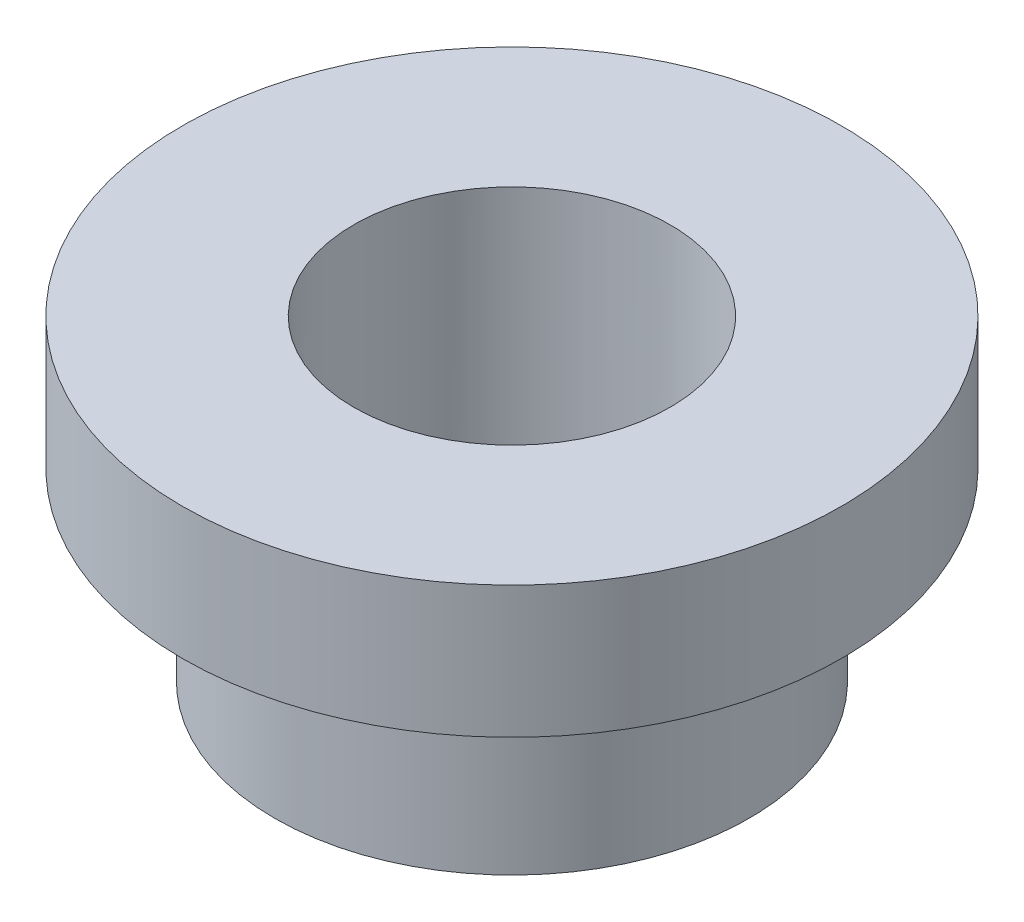
ISO-10303-21;
HEADER;
FILE_DESCRIPTION(('STEP AP214'),'2;1');
FILE_NAME('part.step','',(''),(''),'','','');
FILE_SCHEMA(('AUTOMOTIVE_DESIGN { 1 0 10303 214 1 1 1 1 }'));
ENDSEC;
DATA;
#1=APPLICATION_CONTEXT('core data for automotive mechanical design processes');
#2=APPLICATION_PROTOCOL_DEFINITION('international standard','automotive_design',2000,#1);
#3=PRODUCT_CONTEXT('',#1,'mechanical');
#4=PRODUCT('Part','Part','',(#3));
#5=PRODUCT_RELATED_PRODUCT_CATEGORY('part','',(#4));
#6=PRODUCT_DEFINITION_FORMATION('','',#4);
#7=PRODUCT_DEFINITION_CONTEXT('part definition',#1,'design');
#8=PRODUCT_DEFINITION('design','',#6,#7);
#9=PRODUCT_DEFINITION_SHAPE('','',#8);
#10=(LENGTH_UNIT() NAMED_UNIT(*) SI_UNIT(.MILLI.,.METRE.));
#11=(NAMED_UNIT(*) PLANE_ANGLE_UNIT() SI_UNIT($,.RADIAN.));
#12=(NAMED_UNIT(*) SI_UNIT($,.STERADIAN.) SOLID_ANGLE_UNIT());
#13=UNCERTAINTY_MEASURE_WITH_UNIT(LENGTH_MEASURE(1.E-05),#10,'distance_accuracy_value','');
#14=(GEOMETRIC_REPRESENTATION_CONTEXT(3) GLOBAL_UNCERTAINTY_ASSIGNED_CONTEXT((#13)) GLOBAL_UNIT_ASSIGNED_CONTEXT((#10,
#11,#12)) REPRESENTATION_CONTEXT('',''));
#15=CARTESIAN_POINT('',(0.,0.,0.));
#16=DIRECTION('',(0.,0.,1.));
#17=DIRECTION('',(1.,0.,0.));
#18=AXIS2_PLACEMENT_3D('',#15,#16,#17);
#19=CARTESIAN_POINT('',(0.,-0.5,0.));
#20=DIRECTION('',(0.,1.,0.));
#21=DIRECTION('',(0.,0.,1.));
#22=AXIS2_PLACEMENT_3D('',#19,#20,#21);
#23=PLANE('',#22);
#24=CARTESIAN_POINT('',(0.,-0.5,0.));
#25=DIRECTION('',(0.,1.,0.));
#26=DIRECTION('',(0.,0.,1.));
#27=AXIS2_PLACEMENT_3D('',#24,#25,#26);
#28=CIRCLE('',#27,1.25);
#29=CARTESIAN_POINT('',(0.,-0.5,1.25));
#30=VERTEX_POINT('',#29);
#31=EDGE_CURVE('E42',#30,#30,#28,.T.);
#32=ORIENTED_EDGE('',*,*,#31,.F.);
#33=EDGE_LOOP('',(#32));
#34=FACE_BOUND('',#33,.T.);
#35=CARTESIAN_POINT('',(0.,-0.5,0.));
#36=DIRECTION('',(0.,1.,0.));
#37=DIRECTION('',(0.,0.,1.));
#38=AXIS2_PLACEMENT_3D('',#35,#36,#37);
#39=CIRCLE('',#38,0.9);
#40=CARTESIAN_POINT('',(0.,-0.5,0.9));
#41=VERTEX_POINT('',#40);
#42=EDGE_CURVE('E10',#41,#41,#39,.F.);
#43=ORIENTED_EDGE('',*,*,#42,.F.);
#44=EDGE_LOOP('',(#43));
#45=FACE_BOUND('',#44,.T.);
#46=ADVANCED_FACE('F35',(#34,#45),#23,.F.);
#47=CARTESIAN_POINT('',(0.,-0.5,0.));
#48=DIRECTION('',(0.,1.,0.));
#49=DIRECTION('',(0.,0.,1.));
#50=AXIS2_PLACEMENT_3D('',#47,#48,#49);
#51=CYLINDRICAL_SURFACE('',#50,1.25);
#52=ORIENTED_EDGE('',*,*,#31,.T.);
#53=EDGE_LOOP('',(#52));
#54=FACE_BOUND('',#53,.T.);
#55=CARTESIAN_POINT('',(0.,0.,0.));
#56=DIRECTION('',(0.,1.,0.));
#57=DIRECTION('',(0.,0.,1.));
#58=AXIS2_PLACEMENT_3D('',#55,#56,#57);
#59=CIRCLE('',#58,1.25);
#60=CARTESIAN_POINT('',(0.,0.,1.25));
#61=VERTEX_POINT('',#60);
#62=EDGE_CURVE('E46',#61,#61,#59,.T.);
#63=ORIENTED_EDGE('',*,*,#62,.F.);
#64=EDGE_LOOP('',(#63));
#65=FACE_BOUND('',#64,.T.);
#66=ADVANCED_FACE('F37',(#54,#65),#51,.T.);
#67=CARTESIAN_POINT('',(0.,0.,0.));
#68=DIRECTION('',(0.,1.,0.));
#69=DIRECTION('',(0.,0.,1.));
#70=AXIS2_PLACEMENT_3D('',#67,#68,#69);
#71=PLANE('',#70);
#72=CARTESIAN_POINT('',(0.,0.,0.));
#73=DIRECTION('',(0.,1.,0.));
#74=DIRECTION('',(0.,0.,1.));
#75=AXIS2_PLACEMENT_3D('',#72,#73,#74);
#76=CIRCLE('',#75,0.6);
#77=CARTESIAN_POINT('',(0.,0.,0.6));
#78=VERTEX_POINT('',#77);
#79=EDGE_CURVE('E51',#78,#78,#76,.T.);
#80=ORIENTED_EDGE('',*,*,#79,.F.);
#81=EDGE_LOOP('',(#80));
#82=FACE_BOUND('',#81,.T.);
#83=ORIENTED_EDGE('',*,*,#62,.T.);
#84=EDGE_LOOP('',(#83));
#85=FACE_BOUND('',#84,.T.);
#86=ADVANCED_FACE('F75',(#82,#85),#71,.T.);
#87=CARTESIAN_POINT('',(0.,-0.5,0.));
#88=DIRECTION('',(0.,1.,0.));
#89=DIRECTION('',(0.,0.,1.));
#90=AXIS2_PLACEMENT_3D('',#87,#88,#89);
#91=CYLINDRICAL_SURFACE('',#90,0.6);
#92=ORIENTED_EDGE('',*,*,#79,.T.);
#93=EDGE_LOOP('',(#92));
#94=FACE_BOUND('',#93,.T.);
#95=CARTESIAN_POINT('',(0.,-1.2,0.));
#96=DIRECTION('',(0.,-1.,0.));
#97=DIRECTION('',(0.,0.,-1.));
#98=AXIS2_PLACEMENT_3D('',#95,#96,#97);
#99=CIRCLE('',#98,0.6);
#100=CARTESIAN_POINT('',(0.,-1.2,-0.6));
#101=VERTEX_POINT('',#100);
#102=EDGE_CURVE('E58',#101,#101,#99,.T.);
#103=ORIENTED_EDGE('',*,*,#102,.T.);
#104=EDGE_LOOP('',(#103));
#105=FACE_BOUND('',#104,.T.);
#106=ADVANCED_FACE('F62',(#94,#105),#91,.F.);
#107=CARTESIAN_POINT('',(0.,-1.2,0.));
#108=DIRECTION('',(0.,-1.,0.));
#109=DIRECTION('',(0.,0.,-1.));
#110=AXIS2_PLACEMENT_3D('',#107,#108,#109);
#111=PLANE('',#110);
#112=CARTESIAN_POINT('',(0.,-1.2,0.));
#113=DIRECTION('',(0.,-1.,0.));
#114=DIRECTION('',(0.,0.,-1.));
#115=AXIS2_PLACEMENT_3D('',#112,#113,#114);
#116=CIRCLE('',#115,0.9);
#117=CARTESIAN_POINT('',(0.,-1.2,-0.9));
#118=VERTEX_POINT('',#117);
#119=EDGE_CURVE('E55',#118,#118,#116,.T.);
#120=ORIENTED_EDGE('',*,*,#119,.T.);
#121=EDGE_LOOP('',(#120));
#122=FACE_BOUND('',#121,.T.);
#123=ORIENTED_EDGE('',*,*,#102,.F.);
#124=EDGE_LOOP('',(#123));
#125=FACE_BOUND('',#124,.T.);
#126=ADVANCED_FACE('F64',(#122,#125),#111,.T.);
#127=CARTESIAN_POINT('',(0.,-1.2,0.));
#128=DIRECTION('',(0.,1.,0.));
#129=DIRECTION('',(0.,0.,1.));
#130=AXIS2_PLACEMENT_3D('',#127,#128,#129);
#131=CYLINDRICAL_SURFACE('',#130,0.9);
#132=ORIENTED_EDGE('',*,*,#119,.F.);
#133=EDGE_LOOP('',(#132));
#134=FACE_BOUND('',#133,.T.);
#135=ORIENTED_EDGE('',*,*,#42,.T.);
#136=EDGE_LOOP('',(#135));
#137=FACE_BOUND('',#136,.T.);
#138=ADVANCED_FACE('F66',(#134,#137),#131,.T.);
#139=CLOSED_SHELL('',(#46,#66,#86,#106,#126,#138));
#140=MANIFOLD_SOLID_BREP('B2',#139);
#141=ADVANCED_BREP_SHAPE_REPRESENTATION('',(#18,#140),#14);
#142=SHAPE_DEFINITION_REPRESENTATION(#9,#141);
ENDSEC;
END-ISO-10303-21;
